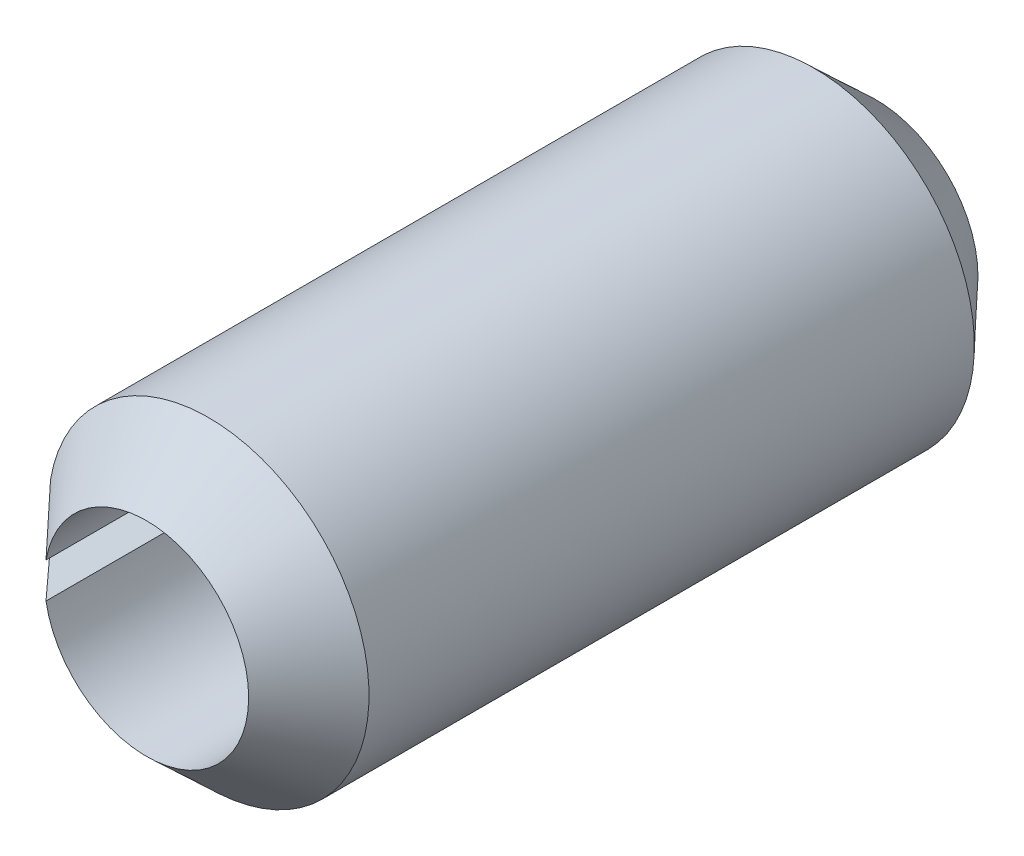
ISO-10303-21;
HEADER;
FILE_DESCRIPTION(('STEP AP214'),'2;1');
FILE_NAME('part.step','',(''),(''),'','','');
FILE_SCHEMA(('AUTOMOTIVE_DESIGN { 1 0 10303 214 1 1 1 1 }'));
ENDSEC;
DATA;
#1=APPLICATION_CONTEXT('core data for automotive mechanical design processes');
#2=APPLICATION_PROTOCOL_DEFINITION('international standard','automotive_design',2000,#1);
#3=PRODUCT_CONTEXT('',#1,'mechanical');
#4=PRODUCT('Part','Part','',(#3));
#5=PRODUCT_RELATED_PRODUCT_CATEGORY('part','',(#4));
#6=PRODUCT_DEFINITION_FORMATION('','',#4);
#7=PRODUCT_DEFINITION_CONTEXT('part definition',#1,'design');
#8=PRODUCT_DEFINITION('design','',#6,#7);
#9=PRODUCT_DEFINITION_SHAPE('','',#8);
#10=(LENGTH_UNIT() NAMED_UNIT(*) SI_UNIT(.MILLI.,.METRE.));
#11=(NAMED_UNIT(*) PLANE_ANGLE_UNIT() SI_UNIT($,.RADIAN.));
#12=(NAMED_UNIT(*) SI_UNIT($,.STERADIAN.) SOLID_ANGLE_UNIT());
#13=UNCERTAINTY_MEASURE_WITH_UNIT(LENGTH_MEASURE(1.E-05),#10,'distance_accuracy_value','');
#14=(GEOMETRIC_REPRESENTATION_CONTEXT(3) GLOBAL_UNCERTAINTY_ASSIGNED_CONTEXT((#13)) GLOBAL_UNIT_ASSIGNED_CONTEXT((#10,
#11,#12)) REPRESENTATION_CONTEXT('',''));
#15=CARTESIAN_POINT('',(0.,0.,0.));
#16=DIRECTION('',(0.,0.,1.));
#17=DIRECTION('',(1.,0.,0.));
#18=AXIS2_PLACEMENT_3D('',#15,#16,#17);
#19=CARTESIAN_POINT('',(0.,0.,5.));
#20=DIRECTION('',(0.,0.,-1.));
#21=DIRECTION('',(-1.,0.,0.));
#22=AXIS2_PLACEMENT_3D('',#19,#20,#21);
#23=CYLINDRICAL_SURFACE('',#22,1.4);
#24=CARTESIAN_POINT('',(0.,0.,-5.));
#25=DIRECTION('',(0.,0.,-1.));
#26=DIRECTION('',(1.,0.,0.));
#27=AXIS2_PLACEMENT_3D('',#24,#25,#26);
#28=CIRCLE('',#27,1.4);
#29=CARTESIAN_POINT('',(-1.37873085421709,0.243107448733698,-5.));
#30=VERTEX_POINT('',#29);
#31=CARTESIAN_POINT('',(-1.37873085421709,-0.243107448733698,-5.));
#32=VERTEX_POINT('',#31);
#33=EDGE_CURVE('E91',#30,#32,#28,.T.);
#34=ORIENTED_EDGE('',*,*,#33,.T.);
#35=DIRECTION('',(0.,0.,-1.));
#36=VECTOR('',#35,1.);
#37=CARTESIAN_POINT('',(-1.37873085421709,-0.243107448733698,5.));
#38=LINE('',#37,#36);
#39=CARTESIAN_POINT('',(-1.37873085421709,-0.243107448733698,5.));
#40=VERTEX_POINT('',#39);
#41=EDGE_CURVE('E11',#40,#32,#38,.T.);
#42=ORIENTED_EDGE('',*,*,#41,.F.);
#43=CARTESIAN_POINT('',(0.,0.,5.));
#44=DIRECTION('',(0.,0.,-1.));
#45=DIRECTION('',(1.,0.,0.));
#46=AXIS2_PLACEMENT_3D('',#43,#44,#45);
#47=CIRCLE('',#46,1.4);
#48=CARTESIAN_POINT('',(-1.37873085421709,0.243107448733698,5.));
#49=VERTEX_POINT('',#48);
#50=EDGE_CURVE('E88',#49,#40,#47,.T.);
#51=ORIENTED_EDGE('',*,*,#50,.F.);
#52=DIRECTION('',(0.,0.,-1.));
#53=VECTOR('',#52,1.);
#54=CARTESIAN_POINT('',(-1.37873085421709,0.243107448733698,5.));
#55=LINE('',#54,#53);
#56=EDGE_CURVE('E80',#49,#30,#55,.T.);
#57=ORIENTED_EDGE('',*,*,#56,.T.);
#58=EDGE_LOOP('',(#34,#42,#51,#57));
#59=FACE_BOUND('',#58,.T.);
#60=ADVANCED_FACE('F32',(#59),#23,.F.);
#61=CARTESIAN_POINT('',(-1.37873085421709,-0.243107448733698,5.));
#62=DIRECTION('',(0.173648177666928,-0.984807753012208,0.));
#63=DIRECTION('',(0.984807753012209,0.173648177666928,0.));
#64=AXIS2_PLACEMENT_3D('',#61,#62,#63);
#65=PLANE('',#64);
#66=DIRECTION('',(0.,0.,-1.));
#67=VECTOR('',#66,1.);
#68=CARTESIAN_POINT('',(-2.16657705662686,-0.382025990867239,5.));
#69=LINE('',#68,#67);
#70=CARTESIAN_POINT('',(-2.16657705662686,-0.38202599086724,4.15));
#71=VERTEX_POINT('',#70);
#72=CARTESIAN_POINT('',(-2.16657705662686,-0.38202599086724,-4.15));
#73=VERTEX_POINT('',#72);
#74=EDGE_CURVE('E40',#71,#73,#69,.T.);
#75=ORIENTED_EDGE('',*,*,#74,.F.);
#76=DIRECTION('',(-0.674952469220995,-0.119012331019459,-0.728199992692802));
#77=VECTOR('',#76,1.);
#78=CARTESIAN_POINT('',(0.,0.,6.4875));
#79=LINE('',#78,#77);
#80=EDGE_CURVE('E69',#71,#40,#79,.F.);
#81=ORIENTED_EDGE('',*,*,#80,.T.);
#82=ORIENTED_EDGE('',*,*,#41,.T.);
#83=DIRECTION('',(0.674952469220995,0.119012331019459,-0.728199992692802));
#84=VECTOR('',#83,1.);
#85=CARTESIAN_POINT('',(0.,0.,-6.4875));
#86=LINE('',#85,#84);
#87=EDGE_CURVE('E94',#32,#73,#86,.F.);
#88=ORIENTED_EDGE('',*,*,#87,.T.);
#89=EDGE_LOOP('',(#75,#81,#82,#88));
#90=FACE_BOUND('',#89,.T.);
#91=ADVANCED_FACE('F103',(#90),#65,.F.);
#92=CARTESIAN_POINT('',(0.,0.,5.));
#93=DIRECTION('',(0.,0.,-1.));
#94=DIRECTION('',(-1.,0.,0.));
#95=AXIS2_PLACEMENT_3D('',#92,#93,#94);
#96=CYLINDRICAL_SURFACE('',#95,2.2);
#97=DIRECTION('',(0.,0.,-1.));
#98=VECTOR('',#97,1.);
#99=CARTESIAN_POINT('',(-2.16657705662686,0.38202599086724,5.));
#100=LINE('',#99,#98);
#101=CARTESIAN_POINT('',(-2.16657705662686,0.38202599086724,4.15));
#102=VERTEX_POINT('',#101);
#103=CARTESIAN_POINT('',(-2.16657705662686,0.38202599086724,-4.15));
#104=VERTEX_POINT('',#103);
#105=EDGE_CURVE('E77',#102,#104,#100,.T.);
#106=ORIENTED_EDGE('',*,*,#105,.F.);
#107=CARTESIAN_POINT('',(0.,0.,4.15));
#108=DIRECTION('',(0.,0.,-1.));
#109=DIRECTION('',(-1.,0.,0.));
#110=AXIS2_PLACEMENT_3D('',#107,#108,#109);
#111=CIRCLE('',#110,2.2);
#112=EDGE_CURVE('E66',#102,#71,#111,.T.);
#113=ORIENTED_EDGE('',*,*,#112,.T.);
#114=ORIENTED_EDGE('',*,*,#74,.T.);
#115=CARTESIAN_POINT('',(0.,0.,-4.15));
#116=DIRECTION('',(0.,0.,-1.));
#117=DIRECTION('',(-1.,0.,0.));
#118=AXIS2_PLACEMENT_3D('',#115,#116,#117);
#119=CIRCLE('',#118,2.2);
#120=EDGE_CURVE('E86',#104,#73,#119,.T.);
#121=ORIENTED_EDGE('',*,*,#120,.F.);
#122=EDGE_LOOP('',(#106,#113,#114,#121));
#123=FACE_BOUND('',#122,.T.);
#124=ADVANCED_FACE('F84',(#123),#96,.T.);
#125=CARTESIAN_POINT('',(-2.16657705662686,0.38202599086724,5.));
#126=DIRECTION('',(0.173648177666928,0.984807753012208,0.));
#127=DIRECTION('',(-0.984807753012209,0.173648177666928,0.));
#128=AXIS2_PLACEMENT_3D('',#125,#126,#127);
#129=PLANE('',#128);
#130=ORIENTED_EDGE('',*,*,#56,.F.);
#131=DIRECTION('',(0.674952469220995,-0.119012331019459,0.728199992692802));
#132=VECTOR('',#131,1.);
#133=CARTESIAN_POINT('',(0.,0.,6.4875));
#134=LINE('',#133,#132);
#135=EDGE_CURVE('E46',#49,#102,#134,.F.);
#136=ORIENTED_EDGE('',*,*,#135,.T.);
#137=ORIENTED_EDGE('',*,*,#105,.T.);
#138=DIRECTION('',(-0.674952469220995,0.119012331019459,0.728199992692802));
#139=VECTOR('',#138,1.);
#140=CARTESIAN_POINT('',(0.,0.,-6.4875));
#141=LINE('',#140,#139);
#142=EDGE_CURVE('E98',#104,#30,#141,.F.);
#143=ORIENTED_EDGE('',*,*,#142,.T.);
#144=EDGE_LOOP('',(#130,#136,#137,#143));
#145=FACE_BOUND('',#144,.T.);
#146=ADVANCED_FACE('F75',(#145),#129,.F.);
#147=CARTESIAN_POINT('',(0.,0.,-4.15));
#148=DIRECTION('',(0.,0.,1.));
#149=DIRECTION('',(1.,0.,0.));
#150=AXIS2_PLACEMENT_3D('',#147,#148,#149);
#151=CONICAL_SURFACE('',#150,2.2,0.755104403478674);
#152=ORIENTED_EDGE('',*,*,#33,.F.);
#153=ORIENTED_EDGE('',*,*,#142,.F.);
#154=ORIENTED_EDGE('',*,*,#120,.T.);
#155=ORIENTED_EDGE('',*,*,#87,.F.);
#156=EDGE_LOOP('',(#152,#153,#154,#155));
#157=FACE_BOUND('',#156,.T.);
#158=ADVANCED_FACE('F106',(#157),#151,.T.);
#159=CARTESIAN_POINT('',(0.,0.,5.));
#160=DIRECTION('',(0.,0.,-1.));
#161=DIRECTION('',(-1.,0.,0.));
#162=AXIS2_PLACEMENT_3D('',#159,#160,#161);
#163=CONICAL_SURFACE('',#162,1.4,0.755104403478674);
#164=ORIENTED_EDGE('',*,*,#112,.F.);
#165=ORIENTED_EDGE('',*,*,#135,.F.);
#166=ORIENTED_EDGE('',*,*,#50,.T.);
#167=ORIENTED_EDGE('',*,*,#80,.F.);
#168=EDGE_LOOP('',(#164,#165,#166,#167));
#169=FACE_BOUND('',#168,.T.);
#170=ADVANCED_FACE('F67',(#169),#163,.T.);
#171=CLOSED_SHELL('',(#60,#91,#124,#146,#158,#170));
#172=MANIFOLD_SOLID_BREP('B2',#171);
#173=ADVANCED_BREP_SHAPE_REPRESENTATION('',(#18,#172),#14);
#174=SHAPE_DEFINITION_REPRESENTATION(#9,#173);
ENDSEC;
END-ISO-10303-21;
